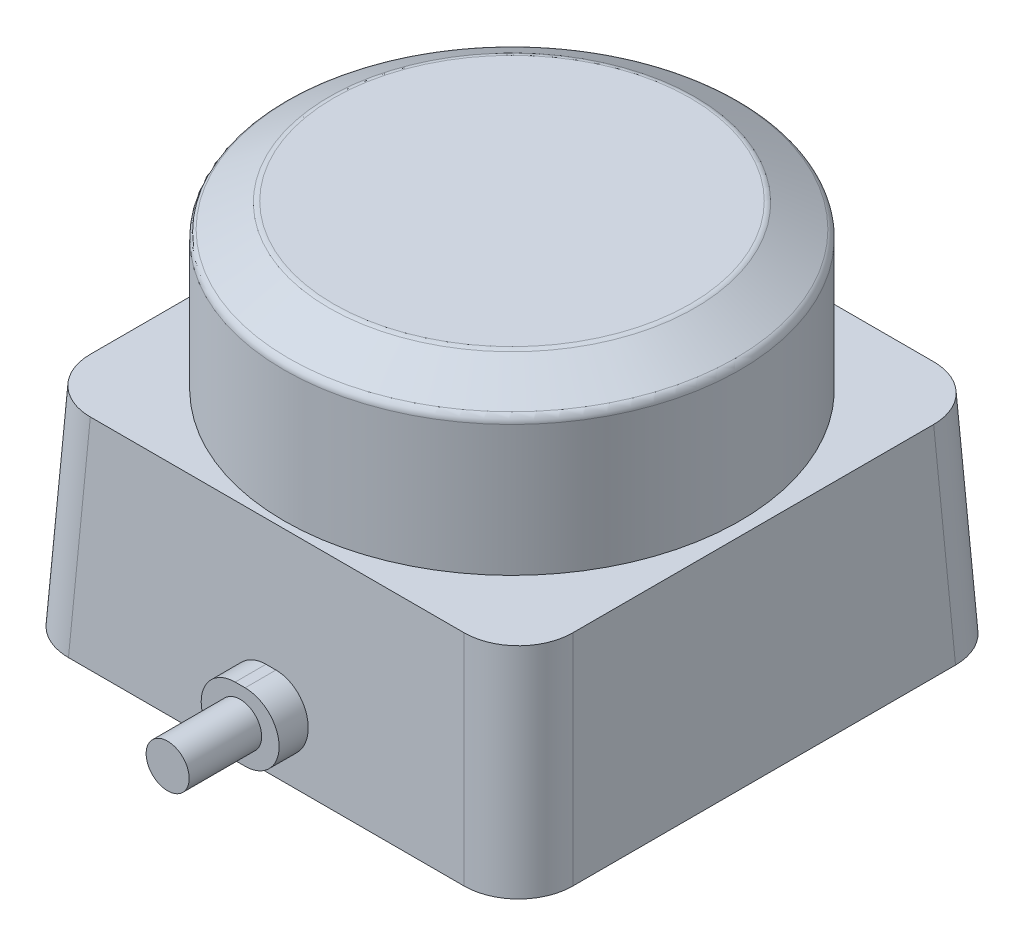
ISO-10303-21;
HEADER;
FILE_DESCRIPTION(('STEP AP214'),'2;1');
FILE_NAME('part.step','',(''),(''),'','','');
FILE_SCHEMA(('AUTOMOTIVE_DESIGN { 1 0 10303 214 1 1 1 1 }'));
ENDSEC;
DATA;
#1=APPLICATION_CONTEXT('core data for automotive mechanical design processes');
#2=APPLICATION_PROTOCOL_DEFINITION('international standard','automotive_design',2000,#1);
#3=PRODUCT_CONTEXT('',#1,'mechanical');
#4=PRODUCT('Part','Part','',(#3));
#5=PRODUCT_RELATED_PRODUCT_CATEGORY('part','',(#4));
#6=PRODUCT_DEFINITION_FORMATION('','',#4);
#7=PRODUCT_DEFINITION_CONTEXT('part definition',#1,'design');
#8=PRODUCT_DEFINITION('design','',#6,#7);
#9=PRODUCT_DEFINITION_SHAPE('','',#8);
#10=(LENGTH_UNIT() NAMED_UNIT(*) SI_UNIT(.MILLI.,.METRE.));
#11=(NAMED_UNIT(*) PLANE_ANGLE_UNIT() SI_UNIT($,.RADIAN.));
#12=(NAMED_UNIT(*) SI_UNIT($,.STERADIAN.) SOLID_ANGLE_UNIT());
#13=UNCERTAINTY_MEASURE_WITH_UNIT(LENGTH_MEASURE(1.E-05),#10,'distance_accuracy_value','');
#14=(GEOMETRIC_REPRESENTATION_CONTEXT(3) GLOBAL_UNCERTAINTY_ASSIGNED_CONTEXT((#13)) GLOBAL_UNIT_ASSIGNED_CONTEXT((#10,
#11,#12)) REPRESENTATION_CONTEXT('',''));
#15=CARTESIAN_POINT('',(0.,0.,0.));
#16=DIRECTION('',(0.,0.,1.));
#17=DIRECTION('',(1.,0.,0.));
#18=AXIS2_PLACEMENT_3D('',#15,#16,#17);
#19=CARTESIAN_POINT('',(27.825,0.,27.1102578546878));
#20=DIRECTION('',(0.,0.0523359562429439,0.998629534754574));
#21=DIRECTION('',(0.,-0.998629534754574,0.052335956242944));
#22=AXIS2_PLACEMENT_3D('',#19,#20,#21);
#23=PLANE('',#22);
#24=DIRECTION('',(-1.,0.,0.));
#25=VECTOR('',#24,1.);
#26=CARTESIAN_POINT('',(27.825,23.,25.9048789311779));
#27=LINE('',#26,#25);
#28=CARTESIAN_POINT('',(-20.6278438679626,23.,25.9048789311779));
#29=VERTEX_POINT('',#28);
#30=CARTESIAN_POINT('',(20.6278438679626,23.,25.9048789311779));
#31=VERTEX_POINT('',#30);
#32=EDGE_CURVE('E191',#29,#31,#27,.F.);
#33=ORIENTED_EDGE('',*,*,#32,.F.);
#34=DIRECTION('',(0.0522644276887141,0.997264688634237,-0.052264427688714));
#35=VECTOR('',#34,1.);
#36=CARTESIAN_POINT('',(-21.6975778598979,2.58825948037393,26.9746129231132));
#37=LINE('',#36,#35);
#38=CARTESIAN_POINT('',(-21.8332227914726,0.,27.1102578546878));
#39=VERTEX_POINT('',#38);
#40=EDGE_CURVE('E232',#29,#39,#37,.F.);
#41=ORIENTED_EDGE('',*,*,#40,.T.);
#42=DIRECTION('',(1.,0.,0.));
#43=VECTOR('',#42,1.);
#44=CARTESIAN_POINT('',(27.825,0.,27.1102578546878));
#45=LINE('',#44,#43);
#46=CARTESIAN_POINT('',(21.8332227914726,0.,27.1102578546878));
#47=VERTEX_POINT('',#46);
#48=EDGE_CURVE('E170',#39,#47,#45,.T.);
#49=ORIENTED_EDGE('',*,*,#48,.T.);
#50=DIRECTION('',(-0.0522644276887141,0.997264688634237,-0.052264427688714));
#51=VECTOR('',#50,1.);
#52=CARTESIAN_POINT('',(21.8495897527485,-0.312300225269494,27.1266248159638));
#53=LINE('',#52,#51);
#54=EDGE_CURVE('E230',#47,#31,#53,.T.);
#55=ORIENTED_EDGE('',*,*,#54,.T.);
#56=EDGE_LOOP('',(#33,#41,#49,#55));
#57=FACE_BOUND('',#56,.T.);
#58=CARTESIAN_POINT('',(0.55,6.,26.7958111789896));
#59=DIRECTION('',(0.,0.0523359562429439,0.998629534754574));
#60=DIRECTION('',(0.,0.998629534754574,-0.052335956242944));
#61=AXIS2_PLACEMENT_3D('',#58,#59,#60);
#62=ELLIPSE('',#61,3.7551462974922,3.75);
#63=CARTESIAN_POINT('',(0.549999999999999,2.25,26.992340351301));
#64=VERTEX_POINT('',#63);
#65=CARTESIAN_POINT('',(0.549999999999998,9.75,26.5992820066782));
#66=VERTEX_POINT('',#65);
#67=EDGE_CURVE('E166',#64,#66,#62,.T.);
#68=ORIENTED_EDGE('',*,*,#67,.F.);
#69=DIRECTION('',(-1.,0.,0.));
#70=VECTOR('',#69,1.);
#71=CARTESIAN_POINT('',(27.825,2.25,26.992340351301));
#72=LINE('',#71,#70);
#73=CARTESIAN_POINT('',(-0.549999999999998,2.25,26.992340351301));
#74=VERTEX_POINT('',#73);
#75=EDGE_CURVE('E178',#74,#64,#72,.F.);
#76=ORIENTED_EDGE('',*,*,#75,.F.);
#77=CARTESIAN_POINT('',(-0.55,6.,26.7958111789896));
#78=DIRECTION('',(0.,0.0523359562429439,0.998629534754574));
#79=DIRECTION('',(0.,0.998629534754574,-0.052335956242944));
#80=AXIS2_PLACEMENT_3D('',#77,#78,#79);
#81=ELLIPSE('',#80,3.7551462974922,3.75);
#82=CARTESIAN_POINT('',(-0.55,9.75,26.5992820066782));
#83=VERTEX_POINT('',#82);
#84=EDGE_CURVE('E199',#83,#74,#81,.T.);
#85=ORIENTED_EDGE('',*,*,#84,.F.);
#86=DIRECTION('',(1.,0.,0.));
#87=VECTOR('',#86,1.);
#88=CARTESIAN_POINT('',(27.825,9.75,26.5992820066782));
#89=LINE('',#88,#87);
#90=EDGE_CURVE('E202',#66,#83,#89,.F.);
#91=ORIENTED_EDGE('',*,*,#90,.F.);
#92=EDGE_LOOP('',(#68,#76,#85,#91));
#93=FACE_BOUND('',#92,.T.);
#94=ADVANCED_FACE('F51',(#57,#93),#23,.T.);
#95=CARTESIAN_POINT('',(-27.825,0.,27.1102578546878));
#96=DIRECTION('',(-0.998629534754574,0.0523359562429439,0.));
#97=DIRECTION('',(-0.052335956242944,-0.998629534754574,0.));
#98=AXIS2_PLACEMENT_3D('',#95,#96,#97);
#99=PLANE('',#98);
#100=DIRECTION('',(0.,0.,1.));
#101=VECTOR('',#100,1.);
#102=CARTESIAN_POINT('',(-27.825,0.,27.1102578546878));
#103=LINE('',#102,#101);
#104=CARTESIAN_POINT('',(-27.825,0.,-21.1184806461604));
#105=VERTEX_POINT('',#104);
#106=CARTESIAN_POINT('',(-27.825,0.,21.1184806461604));
#107=VERTEX_POINT('',#106);
#108=EDGE_CURVE('E167',#105,#107,#103,.T.);
#109=ORIENTED_EDGE('',*,*,#108,.T.);
#110=DIRECTION('',(0.052264427688714,0.997264688634237,-0.0522644276887141));
#111=VECTOR('',#110,1.);
#112=CARTESIAN_POINT('',(-27.841366961276,-0.312300225269494,21.1348476074364));
#113=LINE('',#112,#111);
#114=CARTESIAN_POINT('',(-26.61962107649,23.,19.9131017226504));
#115=VERTEX_POINT('',#114);
#116=EDGE_CURVE('E246',#107,#115,#113,.T.);
#117=ORIENTED_EDGE('',*,*,#116,.T.);
#118=DIRECTION('',(0.,0.,-1.));
#119=VECTOR('',#118,1.);
#120=CARTESIAN_POINT('',(-26.61962107649,23.,27.1102578546878));
#121=LINE('',#120,#119);
#122=CARTESIAN_POINT('',(-26.61962107649,23.,-19.9131017226504));
#123=VERTEX_POINT('',#122);
#124=EDGE_CURVE('E188',#123,#115,#121,.F.);
#125=ORIENTED_EDGE('',*,*,#124,.F.);
#126=DIRECTION('',(0.052264427688714,0.997264688634237,0.0522644276887141));
#127=VECTOR('',#126,1.);
#128=CARTESIAN_POINT('',(-27.6932598054032,2.5137526603697,-20.9867404515636));
#129=LINE('',#128,#127);
#130=EDGE_CURVE('E243',#123,#105,#129,.F.);
#131=ORIENTED_EDGE('',*,*,#130,.T.);
#132=EDGE_LOOP('',(#109,#117,#125,#131));
#133=FACE_BOUND('',#132,.T.);
#134=ADVANCED_FACE('F295',(#133),#99,.T.);
#135=CARTESIAN_POINT('',(27.825,0.,27.1102578546878));
#136=DIRECTION('',(0.998629534754574,0.0523359562429439,0.));
#137=DIRECTION('',(-0.052335956242944,0.998629534754574,0.));
#138=AXIS2_PLACEMENT_3D('',#135,#136,#137);
#139=PLANE('',#138);
#140=DIRECTION('',(0.,0.,-1.));
#141=VECTOR('',#140,1.);
#142=CARTESIAN_POINT('',(27.825,0.,27.1102578546878));
#143=LINE('',#142,#141);
#144=CARTESIAN_POINT('',(27.825,0.,21.1184806461604));
#145=VERTEX_POINT('',#144);
#146=CARTESIAN_POINT('',(27.825,0.,-21.1184806461604));
#147=VERTEX_POINT('',#146);
#148=EDGE_CURVE('E183',#145,#147,#143,.T.);
#149=ORIENTED_EDGE('',*,*,#148,.T.);
#150=DIRECTION('',(-0.052264427688714,0.997264688634237,0.0522644276887141));
#151=VECTOR('',#150,1.);
#152=CARTESIAN_POINT('',(27.6932598054032,2.5137526603697,-20.9867404515636));
#153=LINE('',#152,#151);
#154=CARTESIAN_POINT('',(26.61962107649,23.,-19.9131017226504));
#155=VERTEX_POINT('',#154);
#156=EDGE_CURVE('E262',#147,#155,#153,.T.);
#157=ORIENTED_EDGE('',*,*,#156,.T.);
#158=DIRECTION('',(0.,0.,1.));
#159=VECTOR('',#158,1.);
#160=CARTESIAN_POINT('',(26.61962107649,23.,27.1102578546878));
#161=LINE('',#160,#159);
#162=CARTESIAN_POINT('',(26.61962107649,23.,19.9131017226504));
#163=VERTEX_POINT('',#162);
#164=EDGE_CURVE('E194',#163,#155,#161,.F.);
#165=ORIENTED_EDGE('',*,*,#164,.F.);
#166=DIRECTION('',(-0.052264427688714,0.997264688634237,-0.0522644276887141));
#167=VECTOR('',#166,1.);
#168=CARTESIAN_POINT('',(27.841366961276,-0.312300225269494,21.1348476074364));
#169=LINE('',#168,#167);
#170=EDGE_CURVE('E259',#163,#145,#169,.F.);
#171=ORIENTED_EDGE('',*,*,#170,.T.);
#172=EDGE_LOOP('',(#149,#157,#165,#171));
#173=FACE_BOUND('',#172,.T.);
#174=ADVANCED_FACE('F302',(#173),#139,.T.);
#175=CARTESIAN_POINT('',(27.825,0.,-27.1102578546878));
#176=DIRECTION('',(0.,0.0523359562429439,-0.998629534754574));
#177=DIRECTION('',(0.,0.998629534754574,0.052335956242944));
#178=AXIS2_PLACEMENT_3D('',#175,#176,#177);
#179=PLANE('',#178);
#180=DIRECTION('',(-1.,0.,0.));
#181=VECTOR('',#180,1.);
#182=CARTESIAN_POINT('',(27.825,0.,-27.1102578546878));
#183=LINE('',#182,#181);
#184=CARTESIAN_POINT('',(21.8332227914726,0.,-27.1102578546878));
#185=VERTEX_POINT('',#184);
#186=CARTESIAN_POINT('',(-21.8332227914726,0.,-27.1102578546878));
#187=VERTEX_POINT('',#186);
#188=EDGE_CURVE('E186',#185,#187,#183,.T.);
#189=ORIENTED_EDGE('',*,*,#188,.T.);
#190=DIRECTION('',(0.0522644276887141,0.997264688634237,0.052264427688714));
#191=VECTOR('',#190,1.);
#192=CARTESIAN_POINT('',(-21.6975778598979,2.58825948037393,-26.9746129231132));
#193=LINE('',#192,#191);
#194=CARTESIAN_POINT('',(-20.6278438679626,23.,-25.9048789311779));
#195=VERTEX_POINT('',#194);
#196=EDGE_CURVE('E66',#187,#195,#193,.T.);
#197=ORIENTED_EDGE('',*,*,#196,.T.);
#198=DIRECTION('',(1.,0.,0.));
#199=VECTOR('',#198,1.);
#200=CARTESIAN_POINT('',(27.825,23.,-25.9048789311779));
#201=LINE('',#200,#199);
#202=CARTESIAN_POINT('',(20.6278438679626,23.,-25.9048789311779));
#203=VERTEX_POINT('',#202);
#204=EDGE_CURVE('E179',#203,#195,#201,.F.);
#205=ORIENTED_EDGE('',*,*,#204,.F.);
#206=DIRECTION('',(-0.0522644276887141,0.997264688634237,0.052264427688714));
#207=VECTOR('',#206,1.);
#208=CARTESIAN_POINT('',(21.8495897527485,-0.312300225269494,-27.1266248159638));
#209=LINE('',#208,#207);
#210=EDGE_CURVE('E255',#203,#185,#209,.F.);
#211=ORIENTED_EDGE('',*,*,#210,.T.);
#212=EDGE_LOOP('',(#189,#197,#205,#211));
#213=FACE_BOUND('',#212,.T.);
#214=ADVANCED_FACE('F367',(#213),#179,.T.);
#215=CARTESIAN_POINT('',(0.,23.,0.));
#216=DIRECTION('',(0.,1.,0.));
#217=DIRECTION('',(0.,0.,1.));
#218=AXIS2_PLACEMENT_3D('',#215,#216,#217);
#219=PLANE('',#218);
#220=CARTESIAN_POINT('',(0.,23.,0.));
#221=DIRECTION('',(0.,1.,0.));
#222=DIRECTION('',(0.,0.,1.));
#223=AXIS2_PLACEMENT_3D('',#220,#221,#222);
#224=CIRCLE('',#223,25.15);
#225=CARTESIAN_POINT('',(0.,23.,25.15));
#226=VERTEX_POINT('',#225);
#227=EDGE_CURVE('E176',#226,#226,#224,.T.);
#228=ORIENTED_EDGE('',*,*,#227,.F.);
#229=EDGE_LOOP('',(#228));
#230=FACE_BOUND('',#229,.T.);
#231=ORIENTED_EDGE('',*,*,#124,.T.);
#232=CARTESIAN_POINT('',(-20.6113870005025,23.,19.8966448551904));
#233=DIRECTION('',(0.,1.,0.));
#234=DIRECTION('',(-0.707106781186548,0.,0.707106781186548));
#235=AXIS2_PLACEMENT_3D('',#232,#233,#234);
#236=ELLIPSE('',#235,6.0164568828934,6.);
#237=EDGE_CURVE('E253',#115,#29,#236,.T.);
#238=ORIENTED_EDGE('',*,*,#237,.T.);
#239=ORIENTED_EDGE('',*,*,#32,.T.);
#240=CARTESIAN_POINT('',(20.6113870005025,23.,19.8966448551904));
#241=DIRECTION('',(0.,1.,0.));
#242=DIRECTION('',(0.707106781186548,0.,0.707106781186548));
#243=AXIS2_PLACEMENT_3D('',#240,#241,#242);
#244=ELLIPSE('',#243,6.0164568828934,6.);
#245=EDGE_CURVE('E248',#31,#163,#244,.T.);
#246=ORIENTED_EDGE('',*,*,#245,.T.);
#247=ORIENTED_EDGE('',*,*,#164,.T.);
#248=CARTESIAN_POINT('',(20.6113870005025,23.,-19.8966448551904));
#249=DIRECTION('',(0.,1.,0.));
#250=DIRECTION('',(0.707106781186548,0.,-0.707106781186548));
#251=AXIS2_PLACEMENT_3D('',#248,#249,#250);
#252=ELLIPSE('',#251,6.0164568828934,6.);
#253=EDGE_CURVE('E73',#155,#203,#252,.T.);
#254=ORIENTED_EDGE('',*,*,#253,.T.);
#255=ORIENTED_EDGE('',*,*,#204,.T.);
#256=CARTESIAN_POINT('',(-20.6113870005025,23.,-19.8966448551903));
#257=DIRECTION('',(0.,1.,0.));
#258=DIRECTION('',(-0.707106781186548,0.,-0.707106781186548));
#259=AXIS2_PLACEMENT_3D('',#256,#257,#258);
#260=ELLIPSE('',#259,6.0164568828934,6.);
#261=EDGE_CURVE('E251',#195,#123,#260,.T.);
#262=ORIENTED_EDGE('',*,*,#261,.T.);
#263=EDGE_LOOP('',(#231,#238,#239,#246,#247,#254,#255,#262));
#264=FACE_BOUND('',#263,.T.);
#265=ADVANCED_FACE('F361',(#230,#264),#219,.T.);
#266=CARTESIAN_POINT('',(0.,0.,0.));
#267=DIRECTION('',(0.,1.,0.));
#268=DIRECTION('',(0.,0.,1.));
#269=AXIS2_PLACEMENT_3D('',#266,#267,#268);
#270=PLANE('',#269);
#271=CARTESIAN_POINT('',(21.4,0.,-21.4));
#272=DIRECTION('',(0.,1.,0.));
#273=DIRECTION('',(0.,0.,1.));
#274=AXIS2_PLACEMENT_3D('',#271,#272,#273);
#275=CIRCLE('',#274,1.45);
#276=CARTESIAN_POINT('',(21.4,0.,-19.95));
#277=VERTEX_POINT('',#276);
#278=EDGE_CURVE('E218',#277,#277,#275,.T.);
#279=ORIENTED_EDGE('',*,*,#278,.T.);
#280=EDGE_LOOP('',(#279));
#281=FACE_BOUND('',#280,.T.);
#282=CARTESIAN_POINT('',(-21.4,0.,-21.4));
#283=DIRECTION('',(0.,1.,0.));
#284=DIRECTION('',(0.,0.,1.));
#285=AXIS2_PLACEMENT_3D('',#282,#283,#284);
#286=CIRCLE('',#285,1.45);
#287=CARTESIAN_POINT('',(-21.4,0.,-19.95));
#288=VERTEX_POINT('',#287);
#289=EDGE_CURVE('E215',#288,#288,#286,.T.);
#290=ORIENTED_EDGE('',*,*,#289,.T.);
#291=EDGE_LOOP('',(#290));
#292=FACE_BOUND('',#291,.T.);
#293=CARTESIAN_POINT('',(21.4,0.,21.4));
#294=DIRECTION('',(0.,1.,0.));
#295=DIRECTION('',(0.,0.,1.));
#296=AXIS2_PLACEMENT_3D('',#293,#294,#295);
#297=CIRCLE('',#296,1.45);
#298=CARTESIAN_POINT('',(21.4,0.,22.85));
#299=VERTEX_POINT('',#298);
#300=EDGE_CURVE('E212',#299,#299,#297,.T.);
#301=ORIENTED_EDGE('',*,*,#300,.T.);
#302=EDGE_LOOP('',(#301));
#303=FACE_BOUND('',#302,.T.);
#304=CARTESIAN_POINT('',(-21.4,0.,21.4));
#305=DIRECTION('',(0.,1.,0.));
#306=DIRECTION('',(0.,0.,1.));
#307=AXIS2_PLACEMENT_3D('',#304,#305,#306);
#308=CIRCLE('',#307,1.45);
#309=CARTESIAN_POINT('',(-21.4,0.,22.85));
#310=VERTEX_POINT('',#309);
#311=EDGE_CURVE('E209',#310,#310,#308,.T.);
#312=ORIENTED_EDGE('',*,*,#311,.T.);
#313=EDGE_LOOP('',(#312));
#314=FACE_BOUND('',#313,.T.);
#315=ORIENTED_EDGE('',*,*,#48,.F.);
#316=CARTESIAN_POINT('',(-21.8167659240125,0.,21.1020237787003));
#317=DIRECTION('',(0.,1.,0.));
#318=DIRECTION('',(-0.707106781186548,0.,0.707106781186548));
#319=AXIS2_PLACEMENT_3D('',#316,#317,#318);
#320=ELLIPSE('',#319,6.0164568828934,6.);
#321=EDGE_CURVE('E241',#39,#107,#320,.F.);
#322=ORIENTED_EDGE('',*,*,#321,.T.);
#323=ORIENTED_EDGE('',*,*,#108,.F.);
#324=CARTESIAN_POINT('',(-21.8167659240125,0.,-21.1020237787003));
#325=DIRECTION('',(0.,1.,0.));
#326=DIRECTION('',(-0.707106781186548,0.,-0.707106781186548));
#327=AXIS2_PLACEMENT_3D('',#324,#325,#326);
#328=ELLIPSE('',#327,6.0164568828934,6.);
#329=EDGE_CURVE('E239',#105,#187,#328,.F.);
#330=ORIENTED_EDGE('',*,*,#329,.T.);
#331=ORIENTED_EDGE('',*,*,#188,.F.);
#332=CARTESIAN_POINT('',(21.8167659240125,0.,-21.1020237787003));
#333=DIRECTION('',(0.,1.,0.));
#334=DIRECTION('',(0.707106781186548,0.,-0.707106781186548));
#335=AXIS2_PLACEMENT_3D('',#332,#333,#334);
#336=ELLIPSE('',#335,6.0164568828934,6.);
#337=EDGE_CURVE('E237',#185,#147,#336,.F.);
#338=ORIENTED_EDGE('',*,*,#337,.T.);
#339=ORIENTED_EDGE('',*,*,#148,.F.);
#340=CARTESIAN_POINT('',(21.8167659240125,0.,21.1020237787003));
#341=DIRECTION('',(0.,1.,0.));
#342=DIRECTION('',(0.707106781186548,0.,0.707106781186548));
#343=AXIS2_PLACEMENT_3D('',#340,#341,#342);
#344=ELLIPSE('',#343,6.0164568828934,6.);
#345=EDGE_CURVE('E235',#145,#47,#344,.F.);
#346=ORIENTED_EDGE('',*,*,#345,.T.);
#347=EDGE_LOOP('',(#315,#322,#323,#330,#331,#338,#339,#346));
#348=FACE_BOUND('',#347,.T.);
#349=ADVANCED_FACE('F290',(#281,#292,#303,#314,#348),#270,.F.);
#350=CARTESIAN_POINT('',(0.,41.,0.));
#351=DIRECTION('',(0.,-1.,0.));
#352=DIRECTION('',(0.,0.,-1.));
#353=AXIS2_PLACEMENT_3D('',#350,#351,#352);
#354=CYLINDRICAL_SURFACE('',#353,25.15);
#355=CARTESIAN_POINT('',(0.,37.4226497308104,0.));
#356=DIRECTION('',(0.,1.,0.));
#357=DIRECTION('',(0.,0.,1.));
#358=AXIS2_PLACEMENT_3D('',#355,#356,#357);
#359=CIRCLE('',#358,25.15);
#360=CARTESIAN_POINT('',(0.,37.4226497308104,25.15));
#361=VERTEX_POINT('',#360);
#362=EDGE_CURVE('E11',#361,#361,#359,.F.);
#363=ORIENTED_EDGE('',*,*,#362,.T.);
#364=EDGE_LOOP('',(#363));
#365=FACE_BOUND('',#364,.T.);
#366=ORIENTED_EDGE('',*,*,#227,.T.);
#367=EDGE_LOOP('',(#366));
#368=FACE_BOUND('',#367,.T.);
#369=ADVANCED_FACE('F283',(#365,#368),#354,.T.);
#370=CARTESIAN_POINT('',(0.,41.,0.));
#371=DIRECTION('',(0.,1.,0.));
#372=DIRECTION('',(0.,0.,1.));
#373=AXIS2_PLACEMENT_3D('',#370,#371,#372);
#374=PLANE('',#373);
#375=CARTESIAN_POINT('',(0.,41.,0.));
#376=DIRECTION('',(0.,1.,0.));
#377=DIRECTION('',(0.,0.,1.));
#378=AXIS2_PLACEMENT_3D('',#375,#376,#377);
#379=CIRCLE('',#378,19.6858983848623);
#380=CARTESIAN_POINT('',(0.,41.,19.6858983848623));
#381=VERTEX_POINT('',#380);
#382=EDGE_CURVE('E264',#381,#381,#379,.T.);
#383=ORIENTED_EDGE('',*,*,#382,.T.);
#384=EDGE_LOOP('',(#383));
#385=FACE_BOUND('',#384,.T.);
#386=ADVANCED_FACE('F281',(#385),#374,.T.);
#387=CARTESIAN_POINT('',(0.,41.,0.));
#388=DIRECTION('',(0.,-1.,0.));
#389=DIRECTION('',(0.,0.,-1.));
#390=AXIS2_PLACEMENT_3D('',#387,#388,#389);
#391=CONICAL_SURFACE('',#390,19.9538475772934,1.0471975511966);
#392=CARTESIAN_POINT('',(0.,40.8660254037844,0.));
#393=DIRECTION('',(0.,1.,0.));
#394=DIRECTION('',(0.,0.,1.));
#395=AXIS2_PLACEMENT_3D('',#392,#393,#394);
#396=CIRCLE('',#395,20.1858983848623);
#397=CARTESIAN_POINT('',(0.,40.8660254037844,20.1858983848623));
#398=VERTEX_POINT('',#397);
#399=EDGE_CURVE('E59',#398,#398,#396,.F.);
#400=ORIENTED_EDGE('',*,*,#399,.T.);
#401=EDGE_LOOP('',(#400));
#402=FACE_BOUND('',#401,.T.);
#403=CARTESIAN_POINT('',(0.,38.2886751345948,0.));
#404=DIRECTION('',(0.,-1.,0.));
#405=DIRECTION('',(0.,0.,-1.));
#406=AXIS2_PLACEMENT_3D('',#403,#404,#405);
#407=CIRCLE('',#406,24.65);
#408=CARTESIAN_POINT('',(0.,38.2886751345948,-24.65));
#409=VERTEX_POINT('',#408);
#410=EDGE_CURVE('E267',#409,#409,#407,.F.);
#411=ORIENTED_EDGE('',*,*,#410,.T.);
#412=EDGE_LOOP('',(#411));
#413=FACE_BOUND('',#412,.T.);
#414=ADVANCED_FACE('F272',(#402,#413),#391,.T.);
#415=CARTESIAN_POINT('',(0.55,6.,30.));
#416=DIRECTION('',(0.,0.,-1.));
#417=DIRECTION('',(-1.,0.,0.));
#418=AXIS2_PLACEMENT_3D('',#415,#416,#417);
#419=CYLINDRICAL_SURFACE('',#418,3.75);
#420=DIRECTION('',(0.,0.,-1.));
#421=VECTOR('',#420,1.);
#422=CARTESIAN_POINT('',(0.549999999999999,2.25,30.));
#423=LINE('',#422,#421);
#424=CARTESIAN_POINT('',(0.549999999999999,2.25,30.));
#425=VERTEX_POINT('',#424);
#426=EDGE_CURVE('E662',#425,#64,#423,.T.);
#427=ORIENTED_EDGE('',*,*,#426,.T.);
#428=ORIENTED_EDGE('',*,*,#67,.T.);
#429=DIRECTION('',(0.,0.,-1.));
#430=VECTOR('',#429,1.);
#431=CARTESIAN_POINT('',(0.55,9.75,30.));
#432=LINE('',#431,#430);
#433=CARTESIAN_POINT('',(0.55,9.75,30.));
#434=VERTEX_POINT('',#433);
#435=EDGE_CURVE('E147',#434,#66,#432,.T.);
#436=ORIENTED_EDGE('',*,*,#435,.F.);
#437=CARTESIAN_POINT('',(0.55,6.,30.));
#438=DIRECTION('',(0.,0.,1.));
#439=DIRECTION('',(1.,0.,0.));
#440=AXIS2_PLACEMENT_3D('',#437,#438,#439);
#441=CIRCLE('',#440,3.75);
#442=EDGE_CURVE('E153',#425,#434,#441,.T.);
#443=ORIENTED_EDGE('',*,*,#442,.F.);
#444=EDGE_LOOP('',(#427,#428,#436,#443));
#445=FACE_BOUND('',#444,.T.);
#446=ADVANCED_FACE('F165',(#445),#419,.T.);
#447=CARTESIAN_POINT('',(0.55,9.75,30.));
#448=DIRECTION('',(0.,-1.,0.));
#449=DIRECTION('',(0.,0.,-1.));
#450=AXIS2_PLACEMENT_3D('',#447,#448,#449);
#451=PLANE('',#450);
#452=ORIENTED_EDGE('',*,*,#435,.T.);
#453=ORIENTED_EDGE('',*,*,#90,.T.);
#454=DIRECTION('',(0.,0.,-1.));
#455=VECTOR('',#454,1.);
#456=CARTESIAN_POINT('',(-0.55,9.75,30.));
#457=LINE('',#456,#455);
#458=CARTESIAN_POINT('',(-0.55,9.75,30.));
#459=VERTEX_POINT('',#458);
#460=EDGE_CURVE('E149',#459,#83,#457,.T.);
#461=ORIENTED_EDGE('',*,*,#460,.F.);
#462=DIRECTION('',(-1.,0.,0.));
#463=VECTOR('',#462,1.);
#464=CARTESIAN_POINT('',(0.55,9.75,30.));
#465=LINE('',#464,#463);
#466=EDGE_CURVE('E142',#434,#459,#465,.T.);
#467=ORIENTED_EDGE('',*,*,#466,.F.);
#468=EDGE_LOOP('',(#452,#453,#461,#467));
#469=FACE_BOUND('',#468,.T.);
#470=ADVANCED_FACE('F144',(#469),#451,.F.);
#471=CARTESIAN_POINT('',(-0.55,6.,30.));
#472=DIRECTION('',(0.,0.,-1.));
#473=DIRECTION('',(-1.,0.,0.));
#474=AXIS2_PLACEMENT_3D('',#471,#472,#473);
#475=CYLINDRICAL_SURFACE('',#474,3.75);
#476=ORIENTED_EDGE('',*,*,#460,.T.);
#477=ORIENTED_EDGE('',*,*,#84,.T.);
#478=DIRECTION('',(0.,0.,-1.));
#479=VECTOR('',#478,1.);
#480=CARTESIAN_POINT('',(-0.549999999999999,2.25,30.));
#481=LINE('',#480,#479);
#482=CARTESIAN_POINT('',(-0.549999999999999,2.25,30.));
#483=VERTEX_POINT('',#482);
#484=EDGE_CURVE('E172',#483,#74,#481,.T.);
#485=ORIENTED_EDGE('',*,*,#484,.F.);
#486=CARTESIAN_POINT('',(-0.55,6.,30.));
#487=DIRECTION('',(0.,0.,1.));
#488=DIRECTION('',(1.,0.,0.));
#489=AXIS2_PLACEMENT_3D('',#486,#487,#488);
#490=CIRCLE('',#489,3.75);
#491=EDGE_CURVE('E152',#459,#483,#490,.T.);
#492=ORIENTED_EDGE('',*,*,#491,.F.);
#493=EDGE_LOOP('',(#476,#477,#485,#492));
#494=FACE_BOUND('',#493,.T.);
#495=ADVANCED_FACE('F444',(#494),#475,.T.);
#496=CARTESIAN_POINT('',(0.549999999999999,2.25,30.));
#497=DIRECTION('',(0.,1.,0.));
#498=DIRECTION('',(0.,0.,1.));
#499=AXIS2_PLACEMENT_3D('',#496,#497,#498);
#500=PLANE('',#499);
#501=ORIENTED_EDGE('',*,*,#484,.T.);
#502=ORIENTED_EDGE('',*,*,#75,.T.);
#503=ORIENTED_EDGE('',*,*,#426,.F.);
#504=DIRECTION('',(1.,0.,0.));
#505=VECTOR('',#504,1.);
#506=CARTESIAN_POINT('',(0.549999999999999,2.25,30.));
#507=LINE('',#506,#505);
#508=EDGE_CURVE('E158',#483,#425,#507,.T.);
#509=ORIENTED_EDGE('',*,*,#508,.F.);
#510=EDGE_LOOP('',(#501,#502,#503,#509));
#511=FACE_BOUND('',#510,.T.);
#512=ADVANCED_FACE('F452',(#511),#500,.F.);
#513=CARTESIAN_POINT('',(0.55,6.,30.));
#514=DIRECTION('',(0.,0.,1.));
#515=DIRECTION('',(1.,0.,0.));
#516=AXIS2_PLACEMENT_3D('',#513,#514,#515);
#517=PLANE('',#516);
#518=CARTESIAN_POINT('',(0.,6.,30.));
#519=DIRECTION('',(0.,0.,1.));
#520=DIRECTION('',(1.,0.,0.));
#521=AXIS2_PLACEMENT_3D('',#518,#519,#520);
#522=CIRCLE('',#521,2.375);
#523=CARTESIAN_POINT('',(2.375,6.,30.));
#524=VERTEX_POINT('',#523);
#525=EDGE_CURVE('E205',#524,#524,#522,.T.);
#526=ORIENTED_EDGE('',*,*,#525,.F.);
#527=EDGE_LOOP('',(#526));
#528=FACE_BOUND('',#527,.T.);
#529=ORIENTED_EDGE('',*,*,#442,.T.);
#530=ORIENTED_EDGE('',*,*,#466,.T.);
#531=ORIENTED_EDGE('',*,*,#491,.T.);
#532=ORIENTED_EDGE('',*,*,#508,.T.);
#533=EDGE_LOOP('',(#529,#530,#531,#532));
#534=FACE_BOUND('',#533,.T.);
#535=ADVANCED_FACE('F156',(#528,#534),#517,.T.);
#536=CARTESIAN_POINT('',(0.,6.,38.));
#537=DIRECTION('',(0.,0.,-1.));
#538=DIRECTION('',(-1.,0.,0.));
#539=AXIS2_PLACEMENT_3D('',#536,#537,#538);
#540=CYLINDRICAL_SURFACE('',#539,2.375);
#541=CARTESIAN_POINT('',(0.,6.,38.));
#542=DIRECTION('',(0.,0.,1.));
#543=DIRECTION('',(1.,0.,0.));
#544=AXIS2_PLACEMENT_3D('',#541,#542,#543);
#545=CIRCLE('',#544,2.375);
#546=CARTESIAN_POINT('',(2.375,6.,38.));
#547=VERTEX_POINT('',#546);
#548=EDGE_CURVE('E162',#547,#547,#545,.T.);
#549=ORIENTED_EDGE('',*,*,#548,.F.);
#550=EDGE_LOOP('',(#549));
#551=FACE_BOUND('',#550,.T.);
#552=ORIENTED_EDGE('',*,*,#525,.T.);
#553=EDGE_LOOP('',(#552));
#554=FACE_BOUND('',#553,.T.);
#555=ADVANCED_FACE('F469',(#551,#554),#540,.T.);
#556=CARTESIAN_POINT('',(0.,6.,38.));
#557=DIRECTION('',(0.,0.,1.));
#558=DIRECTION('',(1.,0.,0.));
#559=AXIS2_PLACEMENT_3D('',#556,#557,#558);
#560=PLANE('',#559);
#561=ORIENTED_EDGE('',*,*,#548,.T.);
#562=EDGE_LOOP('',(#561));
#563=FACE_BOUND('',#562,.T.);
#564=ADVANCED_FACE('F478',(#563),#560,.T.);
#565=CARTESIAN_POINT('',(-21.4,5.,21.4));
#566=DIRECTION('',(0.,-1.,0.));
#567=DIRECTION('',(0.,0.,-1.));
#568=AXIS2_PLACEMENT_3D('',#565,#566,#567);
#569=CYLINDRICAL_SURFACE('',#568,1.25);
#570=CARTESIAN_POINT('',(-21.4,0.346410161513781,21.4));
#571=DIRECTION('',(0.,1.,0.));
#572=DIRECTION('',(0.,0.,1.));
#573=AXIS2_PLACEMENT_3D('',#570,#571,#572);
#574=CIRCLE('',#573,1.25);
#575=CARTESIAN_POINT('',(-21.4,0.346410161513781,22.65));
#576=VERTEX_POINT('',#575);
#577=EDGE_CURVE('E227',#576,#576,#574,.F.);
#578=ORIENTED_EDGE('',*,*,#577,.T.);
#579=EDGE_LOOP('',(#578));
#580=FACE_BOUND('',#579,.T.);
#581=CARTESIAN_POINT('',(-21.4,5.,21.4));
#582=DIRECTION('',(0.,-1.,0.));
#583=DIRECTION('',(0.,0.,-1.));
#584=AXIS2_PLACEMENT_3D('',#581,#582,#583);
#585=CIRCLE('',#584,1.25);
#586=CARTESIAN_POINT('',(-21.4,5.,20.15));
#587=VERTEX_POINT('',#586);
#588=EDGE_CURVE('E653',#587,#587,#585,.T.);
#589=ORIENTED_EDGE('',*,*,#588,.F.);
#590=EDGE_LOOP('',(#589));
#591=FACE_BOUND('',#590,.T.);
#592=ADVANCED_FACE('F487',(#580,#591),#569,.F.);
#593=CARTESIAN_POINT('',(-21.4,5.,21.4));
#594=DIRECTION('',(0.,-1.,0.));
#595=DIRECTION('',(0.,0.,-1.));
#596=AXIS2_PLACEMENT_3D('',#593,#594,#595);
#597=PLANE('',#596);
#598=ORIENTED_EDGE('',*,*,#588,.T.);
#599=EDGE_LOOP('',(#598));
#600=FACE_BOUND('',#599,.T.);
#601=ADVANCED_FACE('F496',(#600),#597,.T.);
#602=CARTESIAN_POINT('',(21.4,5.,21.4));
#603=DIRECTION('',(0.,-1.,0.));
#604=DIRECTION('',(0.,0.,-1.));
#605=AXIS2_PLACEMENT_3D('',#602,#603,#604);
#606=CYLINDRICAL_SURFACE('',#605,1.25);
#607=CARTESIAN_POINT('',(21.4,0.346410161513781,21.4));
#608=DIRECTION('',(0.,1.,0.));
#609=DIRECTION('',(0.,0.,1.));
#610=AXIS2_PLACEMENT_3D('',#607,#608,#609);
#611=CIRCLE('',#610,1.25);
#612=CARTESIAN_POINT('',(21.4,0.346410161513781,22.65));
#613=VERTEX_POINT('',#612);
#614=EDGE_CURVE('E224',#613,#613,#611,.F.);
#615=ORIENTED_EDGE('',*,*,#614,.T.);
#616=EDGE_LOOP('',(#615));
#617=FACE_BOUND('',#616,.T.);
#618=CARTESIAN_POINT('',(21.4,5.,21.4));
#619=DIRECTION('',(0.,-1.,0.));
#620=DIRECTION('',(0.,0.,-1.));
#621=AXIS2_PLACEMENT_3D('',#618,#619,#620);
#622=CIRCLE('',#621,1.25);
#623=CARTESIAN_POINT('',(21.4,5.,20.15));
#624=VERTEX_POINT('',#623);
#625=EDGE_CURVE('E649',#624,#624,#622,.T.);
#626=ORIENTED_EDGE('',*,*,#625,.F.);
#627=EDGE_LOOP('',(#626));
#628=FACE_BOUND('',#627,.T.);
#629=ADVANCED_FACE('F505',(#617,#628),#606,.F.);
#630=CARTESIAN_POINT('',(21.4,5.,21.4));
#631=DIRECTION('',(0.,-1.,0.));
#632=DIRECTION('',(0.,0.,-1.));
#633=AXIS2_PLACEMENT_3D('',#630,#631,#632);
#634=PLANE('',#633);
#635=ORIENTED_EDGE('',*,*,#625,.T.);
#636=EDGE_LOOP('',(#635));
#637=FACE_BOUND('',#636,.T.);
#638=ADVANCED_FACE('F514',(#637),#634,.T.);
#639=CARTESIAN_POINT('',(21.4,5.,-21.4));
#640=DIRECTION('',(0.,-1.,0.));
#641=DIRECTION('',(0.,0.,-1.));
#642=AXIS2_PLACEMENT_3D('',#639,#640,#641);
#643=CYLINDRICAL_SURFACE('',#642,1.25);
#644=CARTESIAN_POINT('',(21.4,0.346410161513781,-21.4));
#645=DIRECTION('',(0.,1.,0.));
#646=DIRECTION('',(0.,0.,1.));
#647=AXIS2_PLACEMENT_3D('',#644,#645,#646);
#648=CIRCLE('',#647,1.25);
#649=CARTESIAN_POINT('',(21.4,0.346410161513781,-20.15));
#650=VERTEX_POINT('',#649);
#651=EDGE_CURVE('E206',#650,#650,#648,.F.);
#652=ORIENTED_EDGE('',*,*,#651,.T.);
#653=EDGE_LOOP('',(#652));
#654=FACE_BOUND('',#653,.T.);
#655=CARTESIAN_POINT('',(21.4,5.,-21.4));
#656=DIRECTION('',(0.,-1.,0.));
#657=DIRECTION('',(0.,0.,-1.));
#658=AXIS2_PLACEMENT_3D('',#655,#656,#657);
#659=CIRCLE('',#658,1.25);
#660=CARTESIAN_POINT('',(21.4,5.,-22.65));
#661=VERTEX_POINT('',#660);
#662=EDGE_CURVE('E646',#661,#661,#659,.T.);
#663=ORIENTED_EDGE('',*,*,#662,.F.);
#664=EDGE_LOOP('',(#663));
#665=FACE_BOUND('',#664,.T.);
#666=ADVANCED_FACE('F523',(#654,#665),#643,.F.);
#667=CARTESIAN_POINT('',(21.4,5.,-21.4));
#668=DIRECTION('',(0.,-1.,0.));
#669=DIRECTION('',(0.,0.,-1.));
#670=AXIS2_PLACEMENT_3D('',#667,#668,#669);
#671=PLANE('',#670);
#672=ORIENTED_EDGE('',*,*,#662,.T.);
#673=EDGE_LOOP('',(#672));
#674=FACE_BOUND('',#673,.T.);
#675=ADVANCED_FACE('F532',(#674),#671,.T.);
#676=CARTESIAN_POINT('',(-21.4,5.,-21.4));
#677=DIRECTION('',(0.,-1.,0.));
#678=DIRECTION('',(0.,0.,-1.));
#679=AXIS2_PLACEMENT_3D('',#676,#677,#678);
#680=CYLINDRICAL_SURFACE('',#679,1.25);
#681=CARTESIAN_POINT('',(-21.4,0.346410161513781,-21.4));
#682=DIRECTION('',(0.,1.,0.));
#683=DIRECTION('',(0.,0.,1.));
#684=AXIS2_PLACEMENT_3D('',#681,#682,#683);
#685=CIRCLE('',#684,1.25);
#686=CARTESIAN_POINT('',(-21.4,0.346410161513781,-20.15));
#687=VERTEX_POINT('',#686);
#688=EDGE_CURVE('E221',#687,#687,#685,.F.);
#689=ORIENTED_EDGE('',*,*,#688,.T.);
#690=EDGE_LOOP('',(#689));
#691=FACE_BOUND('',#690,.T.);
#692=CARTESIAN_POINT('',(-21.4,5.,-21.4));
#693=DIRECTION('',(0.,-1.,0.));
#694=DIRECTION('',(0.,0.,-1.));
#695=AXIS2_PLACEMENT_3D('',#692,#693,#694);
#696=CIRCLE('',#695,1.25);
#697=CARTESIAN_POINT('',(-21.4,5.,-22.65));
#698=VERTEX_POINT('',#697);
#699=EDGE_CURVE('E644',#698,#698,#696,.T.);
#700=ORIENTED_EDGE('',*,*,#699,.F.);
#701=EDGE_LOOP('',(#700));
#702=FACE_BOUND('',#701,.T.);
#703=ADVANCED_FACE('F541',(#691,#702),#680,.F.);
#704=CARTESIAN_POINT('',(-21.4,5.,-21.4));
#705=DIRECTION('',(0.,-1.,0.));
#706=DIRECTION('',(0.,0.,-1.));
#707=AXIS2_PLACEMENT_3D('',#704,#705,#706);
#708=PLANE('',#707);
#709=ORIENTED_EDGE('',*,*,#699,.T.);
#710=EDGE_LOOP('',(#709));
#711=FACE_BOUND('',#710,.T.);
#712=ADVANCED_FACE('F321',(#711),#708,.T.);
#713=CARTESIAN_POINT('',(21.4,0.346410161513781,-21.4));
#714=DIRECTION('',(0.,-1.,0.));
#715=DIRECTION('',(0.,0.,-1.));
#716=AXIS2_PLACEMENT_3D('',#713,#714,#715);
#717=CONICAL_SURFACE('',#716,1.25,0.523598775598289);
#718=ORIENTED_EDGE('',*,*,#278,.F.);
#719=EDGE_LOOP('',(#718));
#720=FACE_BOUND('',#719,.T.);
#721=ORIENTED_EDGE('',*,*,#651,.F.);
#722=EDGE_LOOP('',(#721));
#723=FACE_BOUND('',#722,.T.);
#724=ADVANCED_FACE('F314',(#720,#723),#717,.F.);
#725=CARTESIAN_POINT('',(-21.4,0.346410161513781,-21.4));
#726=DIRECTION('',(0.,-1.,0.));
#727=DIRECTION('',(0.,0.,-1.));
#728=AXIS2_PLACEMENT_3D('',#725,#726,#727);
#729=CONICAL_SURFACE('',#728,1.25,0.523598775598289);
#730=ORIENTED_EDGE('',*,*,#289,.F.);
#731=EDGE_LOOP('',(#730));
#732=FACE_BOUND('',#731,.T.);
#733=ORIENTED_EDGE('',*,*,#688,.F.);
#734=EDGE_LOOP('',(#733));
#735=FACE_BOUND('',#734,.T.);
#736=ADVANCED_FACE('F320',(#732,#735),#729,.F.);
#737=CARTESIAN_POINT('',(21.4,0.346410161513781,21.4));
#738=DIRECTION('',(0.,-1.,0.));
#739=DIRECTION('',(0.,0.,-1.));
#740=AXIS2_PLACEMENT_3D('',#737,#738,#739);
#741=CONICAL_SURFACE('',#740,1.25,0.523598775598289);
#742=ORIENTED_EDGE('',*,*,#300,.F.);
#743=EDGE_LOOP('',(#742));
#744=FACE_BOUND('',#743,.T.);
#745=ORIENTED_EDGE('',*,*,#614,.F.);
#746=EDGE_LOOP('',(#745));
#747=FACE_BOUND('',#746,.T.);
#748=ADVANCED_FACE('F328',(#744,#747),#741,.F.);
#749=CARTESIAN_POINT('',(-21.4,0.346410161513781,21.4));
#750=DIRECTION('',(0.,-1.,0.));
#751=DIRECTION('',(0.,0.,-1.));
#752=AXIS2_PLACEMENT_3D('',#749,#750,#751);
#753=CONICAL_SURFACE('',#752,1.25,0.523598775598289);
#754=ORIENTED_EDGE('',*,*,#311,.F.);
#755=EDGE_LOOP('',(#754));
#756=FACE_BOUND('',#755,.T.);
#757=ORIENTED_EDGE('',*,*,#577,.F.);
#758=EDGE_LOOP('',(#757));
#759=FACE_BOUND('',#758,.T.);
#760=ADVANCED_FACE('F335',(#756,#759),#753,.F.);
#761=CARTESIAN_POINT('',(-21.6975778598979,2.27424374291626,20.9828357145857));
#762=DIRECTION('',(-0.052264427688714,-0.997264688634237,0.052264427688714));
#763=DIRECTION('',(0.,-0.0523359562429439,-0.998629534754574));
#764=AXIS2_PLACEMENT_3D('',#761,#762,#763);
#765=CYLINDRICAL_SURFACE('',#764,6.);
#766=ORIENTED_EDGE('',*,*,#237,.F.);
#767=ORIENTED_EDGE('',*,*,#116,.F.);
#768=ORIENTED_EDGE('',*,*,#321,.F.);
#769=ORIENTED_EDGE('',*,*,#40,.F.);
#770=EDGE_LOOP('',(#766,#767,#768,#769));
#771=FACE_BOUND('',#770,.T.);
#772=ADVANCED_FACE('F340',(#771),#765,.T.);
#773=CARTESIAN_POINT('',(-21.7014825968757,2.19973692291204,-20.9867404515636));
#774=DIRECTION('',(-0.052264427688714,-0.997264688634237,-0.052264427688714));
#775=DIRECTION('',(0.,0.0523359562429439,-0.998629534754574));
#776=AXIS2_PLACEMENT_3D('',#773,#774,#775);
#777=CYLINDRICAL_SURFACE('',#776,6.);
#778=ORIENTED_EDGE('',*,*,#261,.F.);
#779=ORIENTED_EDGE('',*,*,#196,.F.);
#780=ORIENTED_EDGE('',*,*,#329,.F.);
#781=ORIENTED_EDGE('',*,*,#130,.F.);
#782=EDGE_LOOP('',(#778,#779,#780,#781));
#783=FACE_BOUND('',#782,.T.);
#784=ADVANCED_FACE('F344',(#783),#777,.T.);
#785=CARTESIAN_POINT('',(21.8495897527485,-0.626315962727157,-21.1348476074364));
#786=DIRECTION('',(0.052264427688714,-0.997264688634237,-0.052264427688714));
#787=DIRECTION('',(0.,0.0523359562429439,-0.998629534754574));
#788=AXIS2_PLACEMENT_3D('',#785,#786,#787);
#789=CYLINDRICAL_SURFACE('',#788,6.);
#790=ORIENTED_EDGE('',*,*,#253,.F.);
#791=ORIENTED_EDGE('',*,*,#156,.F.);
#792=ORIENTED_EDGE('',*,*,#337,.F.);
#793=ORIENTED_EDGE('',*,*,#210,.F.);
#794=EDGE_LOOP('',(#790,#791,#792,#793));
#795=FACE_BOUND('',#794,.T.);
#796=ADVANCED_FACE('F348',(#795),#789,.T.);
#797=CARTESIAN_POINT('',(21.8495897527485,-0.626315962727157,21.1348476074364));
#798=DIRECTION('',(0.052264427688714,-0.997264688634237,0.052264427688714));
#799=DIRECTION('',(0.,-0.0523359562429439,-0.998629534754574));
#800=AXIS2_PLACEMENT_3D('',#797,#798,#799);
#801=CYLINDRICAL_SURFACE('',#800,6.);
#802=ORIENTED_EDGE('',*,*,#245,.F.);
#803=ORIENTED_EDGE('',*,*,#54,.F.);
#804=ORIENTED_EDGE('',*,*,#345,.F.);
#805=ORIENTED_EDGE('',*,*,#170,.F.);
#806=EDGE_LOOP('',(#802,#803,#804,#805));
#807=FACE_BOUND('',#806,.T.);
#808=ADVANCED_FACE('F278',(#807),#801,.T.);
#809=CARTESIAN_POINT('',(0.,40.,0.));
#810=DIRECTION('',(0.,1.,0.));
#811=DIRECTION('',(0.,0.,1.));
#812=AXIS2_PLACEMENT_3D('',#809,#810,#811);
#813=TOROIDAL_SURFACE('',#812,19.6858983848623,1.);
#814=ORIENTED_EDGE('',*,*,#399,.F.);
#815=EDGE_LOOP('',(#814));
#816=FACE_BOUND('',#815,.T.);
#817=ORIENTED_EDGE('',*,*,#382,.F.);
#818=EDGE_LOOP('',(#817));
#819=FACE_BOUND('',#818,.T.);
#820=ADVANCED_FACE('F275',(#816,#819),#813,.T.);
#821=CARTESIAN_POINT('',(0.,37.4226497308104,0.));
#822=DIRECTION('',(0.,1.,0.));
#823=DIRECTION('',(0.,0.,1.));
#824=AXIS2_PLACEMENT_3D('',#821,#822,#823);
#825=TOROIDAL_SURFACE('',#824,24.15,1.);
#826=ORIENTED_EDGE('',*,*,#410,.F.);
#827=EDGE_LOOP('',(#826));
#828=FACE_BOUND('',#827,.T.);
#829=ORIENTED_EDGE('',*,*,#362,.F.);
#830=EDGE_LOOP('',(#829));
#831=FACE_BOUND('',#830,.T.);
#832=ADVANCED_FACE('F53',(#828,#831),#825,.T.);
#833=CLOSED_SHELL('',(#94,#134,#174,#214,#265,#349,#369,#386,#414,#446,#470,#495,#512,#535,#555,
#564,#592,#601,#629,#638,#666,#675,#703,#712,#724,#736,#748,#760,#772,#784,#796,#808,#820,#832));
#834=MANIFOLD_SOLID_BREP('B2',#833);
#835=ADVANCED_BREP_SHAPE_REPRESENTATION('',(#18,#834),#14);
#836=SHAPE_DEFINITION_REPRESENTATION(#9,#835);
ENDSEC;
END-ISO-10303-21;
